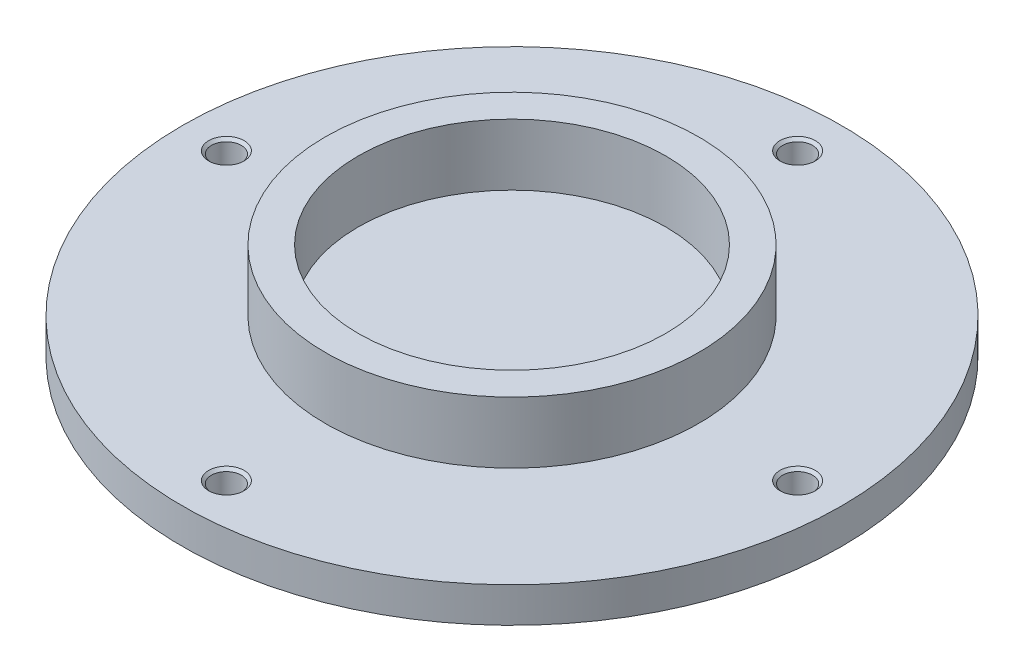
ISO-10303-21;
HEADER;
FILE_DESCRIPTION(('STEP AP214'),'2;1');
FILE_NAME('part.step','',(''),(''),'','','');
FILE_SCHEMA(('AUTOMOTIVE_DESIGN { 1 0 10303 214 1 1 1 1 }'));
ENDSEC;
DATA;
#1=APPLICATION_CONTEXT('core data for automotive mechanical design processes');
#2=APPLICATION_PROTOCOL_DEFINITION('international standard','automotive_design',2000,#1);
#3=PRODUCT_CONTEXT('',#1,'mechanical');
#4=PRODUCT('Part','Part','',(#3));
#5=PRODUCT_RELATED_PRODUCT_CATEGORY('part','',(#4));
#6=PRODUCT_DEFINITION_FORMATION('','',#4);
#7=PRODUCT_DEFINITION_CONTEXT('part definition',#1,'design');
#8=PRODUCT_DEFINITION('design','',#6,#7);
#9=PRODUCT_DEFINITION_SHAPE('','',#8);
#10=(LENGTH_UNIT() NAMED_UNIT(*) SI_UNIT(.MILLI.,.METRE.));
#11=(NAMED_UNIT(*) PLANE_ANGLE_UNIT() SI_UNIT($,.RADIAN.));
#12=(NAMED_UNIT(*) SI_UNIT($,.STERADIAN.) SOLID_ANGLE_UNIT());
#13=UNCERTAINTY_MEASURE_WITH_UNIT(LENGTH_MEASURE(1.E-05),#10,'distance_accuracy_value','');
#14=(GEOMETRIC_REPRESENTATION_CONTEXT(3) GLOBAL_UNCERTAINTY_ASSIGNED_CONTEXT((#13)) GLOBAL_UNIT_ASSIGNED_CONTEXT((#10,
#11,#12)) REPRESENTATION_CONTEXT('',''));
#15=CARTESIAN_POINT('',(0.,0.,0.));
#16=DIRECTION('',(0.,0.,1.));
#17=DIRECTION('',(1.,0.,0.));
#18=AXIS2_PLACEMENT_3D('',#15,#16,#17);
#19=CARTESIAN_POINT('',(0.,0.,0.));
#20=DIRECTION('',(0.,1.,0.));
#21=DIRECTION('',(-1.,0.,0.));
#22=AXIS2_PLACEMENT_3D('',#19,#20,#21);
#23=PLANE('',#22);
#24=CARTESIAN_POINT('',(-65.,-1.26634813746307E-13,0.));
#25=DIRECTION('',(0.,1.,0.));
#26=DIRECTION('',(0.,0.,1.));
#27=AXIS2_PLACEMENT_3D('',#24,#25,#26);
#28=CIRCLE('',#27,3.4);
#29=CARTESIAN_POINT('',(-65.,-1.26634813746307E-13,3.4));
#30=VERTEX_POINT('',#29);
#31=EDGE_CURVE('E95',#30,#30,#28,.T.);
#32=ORIENTED_EDGE('',*,*,#31,.T.);
#33=EDGE_LOOP('',(#32));
#34=FACE_BOUND('',#33,.T.);
#35=CARTESIAN_POINT('',(65.,0.,0.));
#36=DIRECTION('',(0.,1.,0.));
#37=DIRECTION('',(0.,0.,1.));
#38=AXIS2_PLACEMENT_3D('',#35,#36,#37);
#39=CIRCLE('',#38,3.4);
#40=CARTESIAN_POINT('',(65.,0.,3.4));
#41=VERTEX_POINT('',#40);
#42=EDGE_CURVE('E86',#41,#41,#39,.T.);
#43=ORIENTED_EDGE('',*,*,#42,.T.);
#44=EDGE_LOOP('',(#43));
#45=FACE_BOUND('',#44,.T.);
#46=CARTESIAN_POINT('',(0.,0.,65.));
#47=DIRECTION('',(0.,1.,0.));
#48=DIRECTION('',(0.,0.,1.));
#49=AXIS2_PLACEMENT_3D('',#46,#47,#48);
#50=CIRCLE('',#49,3.4);
#51=CARTESIAN_POINT('',(0.,0.,68.4));
#52=VERTEX_POINT('',#51);
#53=EDGE_CURVE('E80',#52,#52,#50,.T.);
#54=ORIENTED_EDGE('',*,*,#53,.T.);
#55=EDGE_LOOP('',(#54));
#56=FACE_BOUND('',#55,.T.);
#57=CARTESIAN_POINT('',(0.,0.,-65.));
#58=DIRECTION('',(0.,1.,0.));
#59=DIRECTION('',(0.,0.,1.));
#60=AXIS2_PLACEMENT_3D('',#57,#58,#59);
#61=CIRCLE('',#60,3.4);
#62=CARTESIAN_POINT('',(0.,0.,-61.6));
#63=VERTEX_POINT('',#62);
#64=EDGE_CURVE('E67',#63,#63,#61,.T.);
#65=ORIENTED_EDGE('',*,*,#64,.T.);
#66=EDGE_LOOP('',(#65));
#67=FACE_BOUND('',#66,.T.);
#68=CARTESIAN_POINT('',(0.,0.,0.));
#69=DIRECTION('',(0.,1.,0.));
#70=DIRECTION('',(-1.,0.,0.));
#71=AXIS2_PLACEMENT_3D('',#68,#69,#70);
#72=CIRCLE('',#71,75.);
#73=CARTESIAN_POINT('',(-75.,0.,0.));
#74=VERTEX_POINT('',#73);
#75=EDGE_CURVE('E10',#74,#74,#72,.T.);
#76=ORIENTED_EDGE('',*,*,#75,.F.);
#77=EDGE_LOOP('',(#76));
#78=FACE_BOUND('',#77,.T.);
#79=ADVANCED_FACE('F43',(#34,#45,#56,#67,#78),#23,.F.);
#80=CARTESIAN_POINT('',(0.,8.,0.));
#81=DIRECTION('',(0.,1.,0.));
#82=DIRECTION('',(-1.,0.,0.));
#83=AXIS2_PLACEMENT_3D('',#80,#81,#82);
#84=CYLINDRICAL_SURFACE('',#83,75.);
#85=CARTESIAN_POINT('',(0.,7.99999999999997,0.));
#86=DIRECTION('',(0.,1.,0.));
#87=DIRECTION('',(-1.,0.,0.));
#88=AXIS2_PLACEMENT_3D('',#85,#86,#87);
#89=CIRCLE('',#88,75.);
#90=CARTESIAN_POINT('',(-75.,7.99999999999993,0.));
#91=VERTEX_POINT('',#90);
#92=EDGE_CURVE('E47',#91,#91,#89,.T.);
#93=ORIENTED_EDGE('',*,*,#92,.F.);
#94=EDGE_LOOP('',(#93));
#95=FACE_BOUND('',#94,.T.);
#96=ORIENTED_EDGE('',*,*,#75,.T.);
#97=EDGE_LOOP('',(#96));
#98=FACE_BOUND('',#97,.T.);
#99=ADVANCED_FACE('F111',(#95,#98),#84,.T.);
#100=CARTESIAN_POINT('',(75.,8.00000000000001,0.));
#101=DIRECTION('',(0.,-1.,0.));
#102=DIRECTION('',(1.,0.,0.));
#103=AXIS2_PLACEMENT_3D('',#100,#101,#102);
#104=PLANE('',#103);
#105=CARTESIAN_POINT('',(-65.,7.99999999999995,0.));
#106=DIRECTION('',(0.,1.,0.));
#107=DIRECTION('',(0.,0.,1.));
#108=AXIS2_PLACEMENT_3D('',#105,#106,#107);
#109=CIRCLE('',#108,4.025);
#110=CARTESIAN_POINT('',(-65.,7.99999999999995,4.025));
#111=VERTEX_POINT('',#110);
#112=EDGE_CURVE('E103',#111,#111,#109,.T.);
#113=ORIENTED_EDGE('',*,*,#112,.F.);
#114=EDGE_LOOP('',(#113));
#115=FACE_BOUND('',#114,.T.);
#116=CARTESIAN_POINT('',(65.,8.,0.));
#117=DIRECTION('',(0.,1.,0.));
#118=DIRECTION('',(0.,0.,1.));
#119=AXIS2_PLACEMENT_3D('',#116,#117,#118);
#120=CIRCLE('',#119,4.025);
#121=CARTESIAN_POINT('',(65.,8.,4.025));
#122=VERTEX_POINT('',#121);
#123=EDGE_CURVE('E92',#122,#122,#120,.T.);
#124=ORIENTED_EDGE('',*,*,#123,.F.);
#125=EDGE_LOOP('',(#124));
#126=FACE_BOUND('',#125,.T.);
#127=CARTESIAN_POINT('',(0.,7.99999999999997,65.));
#128=DIRECTION('',(0.,1.,0.));
#129=DIRECTION('',(0.,0.,1.));
#130=AXIS2_PLACEMENT_3D('',#127,#128,#129);
#131=CIRCLE('',#130,4.025);
#132=CARTESIAN_POINT('',(0.,7.99999999999997,69.025));
#133=VERTEX_POINT('',#132);
#134=EDGE_CURVE('E84',#133,#133,#131,.T.);
#135=ORIENTED_EDGE('',*,*,#134,.F.);
#136=EDGE_LOOP('',(#135));
#137=FACE_BOUND('',#136,.T.);
#138=CARTESIAN_POINT('',(0.,7.99999999999997,-65.));
#139=DIRECTION('',(0.,1.,0.));
#140=DIRECTION('',(0.,0.,1.));
#141=AXIS2_PLACEMENT_3D('',#138,#139,#140);
#142=CIRCLE('',#141,4.025);
#143=CARTESIAN_POINT('',(0.,7.99999999999997,-60.975));
#144=VERTEX_POINT('',#143);
#145=EDGE_CURVE('E73',#144,#144,#142,.T.);
#146=ORIENTED_EDGE('',*,*,#145,.F.);
#147=EDGE_LOOP('',(#146));
#148=FACE_BOUND('',#147,.T.);
#149=CARTESIAN_POINT('',(0.,7.99999999999998,0.));
#150=DIRECTION('',(0.,1.,0.));
#151=DIRECTION('',(-1.,0.,0.));
#152=AXIS2_PLACEMENT_3D('',#149,#150,#151);
#153=CIRCLE('',#152,42.5);
#154=CARTESIAN_POINT('',(-42.5,7.99999999999996,0.));
#155=VERTEX_POINT('',#154);
#156=EDGE_CURVE('E52',#155,#155,#153,.T.);
#157=ORIENTED_EDGE('',*,*,#156,.F.);
#158=EDGE_LOOP('',(#157));
#159=FACE_BOUND('',#158,.T.);
#160=ORIENTED_EDGE('',*,*,#92,.T.);
#161=EDGE_LOOP('',(#160));
#162=FACE_BOUND('',#161,.T.);
#163=ADVANCED_FACE('F110',(#115,#126,#137,#148,#159,#162),#104,.F.);
#164=CARTESIAN_POINT('',(0.,8.,0.));
#165=DIRECTION('',(0.,1.,0.));
#166=DIRECTION('',(-1.,0.,0.));
#167=AXIS2_PLACEMENT_3D('',#164,#165,#166);
#168=CYLINDRICAL_SURFACE('',#167,42.5);
#169=CARTESIAN_POINT('',(0.,22.,0.));
#170=DIRECTION('',(0.,1.,0.));
#171=DIRECTION('',(-1.,0.,0.));
#172=AXIS2_PLACEMENT_3D('',#169,#170,#171);
#173=CIRCLE('',#172,42.5);
#174=CARTESIAN_POINT('',(-42.5,22.,0.));
#175=VERTEX_POINT('',#174);
#176=EDGE_CURVE('E60',#175,#175,#173,.T.);
#177=ORIENTED_EDGE('',*,*,#176,.F.);
#178=EDGE_LOOP('',(#177));
#179=FACE_BOUND('',#178,.T.);
#180=ORIENTED_EDGE('',*,*,#156,.T.);
#181=EDGE_LOOP('',(#180));
#182=FACE_BOUND('',#181,.T.);
#183=ADVANCED_FACE('F109',(#179,#182),#168,.T.);
#184=CARTESIAN_POINT('',(42.5,22.,0.));
#185=DIRECTION('',(0.,-1.,0.));
#186=DIRECTION('',(1.,0.,0.));
#187=AXIS2_PLACEMENT_3D('',#184,#185,#186);
#188=PLANE('',#187);
#189=CARTESIAN_POINT('',(0.,22.,0.));
#190=DIRECTION('',(0.,1.,0.));
#191=DIRECTION('',(-1.,0.,0.));
#192=AXIS2_PLACEMENT_3D('',#189,#190,#191);
#193=CIRCLE('',#192,35.);
#194=CARTESIAN_POINT('',(-35.,22.,0.));
#195=VERTEX_POINT('',#194);
#196=EDGE_CURVE('E65',#195,#195,#193,.T.);
#197=ORIENTED_EDGE('',*,*,#196,.F.);
#198=EDGE_LOOP('',(#197));
#199=FACE_BOUND('',#198,.T.);
#200=ORIENTED_EDGE('',*,*,#176,.T.);
#201=EDGE_LOOP('',(#200));
#202=FACE_BOUND('',#201,.T.);
#203=ADVANCED_FACE('F125',(#199,#202),#188,.F.);
#204=CARTESIAN_POINT('',(0.,8.,0.));
#205=DIRECTION('',(0.,1.,0.));
#206=DIRECTION('',(-1.,0.,0.));
#207=AXIS2_PLACEMENT_3D('',#204,#205,#206);
#208=CYLINDRICAL_SURFACE('',#207,35.);
#209=CARTESIAN_POINT('',(0.,7.99999999999999,0.));
#210=DIRECTION('',(0.,1.,0.));
#211=DIRECTION('',(-1.,0.,0.));
#212=AXIS2_PLACEMENT_3D('',#209,#210,#211);
#213=CIRCLE('',#212,35.);
#214=CARTESIAN_POINT('',(-35.,7.99999999999997,0.));
#215=VERTEX_POINT('',#214);
#216=EDGE_CURVE('E63',#215,#215,#213,.T.);
#217=ORIENTED_EDGE('',*,*,#216,.F.);
#218=EDGE_LOOP('',(#217));
#219=FACE_BOUND('',#218,.T.);
#220=ORIENTED_EDGE('',*,*,#196,.T.);
#221=EDGE_LOOP('',(#220));
#222=FACE_BOUND('',#221,.T.);
#223=ADVANCED_FACE('F126',(#219,#222),#208,.F.);
#224=CARTESIAN_POINT('',(35.,8.00000000000001,0.));
#225=DIRECTION('',(0.,-1.,0.));
#226=DIRECTION('',(1.,0.,0.));
#227=AXIS2_PLACEMENT_3D('',#224,#225,#226);
#228=PLANE('',#227);
#229=ORIENTED_EDGE('',*,*,#216,.T.);
#230=EDGE_LOOP('',(#229));
#231=FACE_BOUND('',#230,.T.);
#232=ADVANCED_FACE('F155',(#231),#228,.F.);
#233=CARTESIAN_POINT('',(0.,7.99999999999997,-65.));
#234=DIRECTION('',(0.,1.,0.));
#235=DIRECTION('',(0.,0.,1.));
#236=AXIS2_PLACEMENT_3D('',#233,#234,#235);
#237=CYLINDRICAL_SURFACE('',#236,3.4);
#238=ORIENTED_EDGE('',*,*,#64,.F.);
#239=EDGE_LOOP('',(#238));
#240=FACE_BOUND('',#239,.T.);
#241=CARTESIAN_POINT('',(0.,7.37499999999997,-65.));
#242=DIRECTION('',(0.,1.,0.));
#243=DIRECTION('',(0.,0.,1.));
#244=AXIS2_PLACEMENT_3D('',#241,#242,#243);
#245=CIRCLE('',#244,3.4);
#246=CARTESIAN_POINT('',(0.,7.37499999999997,-61.6));
#247=VERTEX_POINT('',#246);
#248=EDGE_CURVE('E71',#247,#247,#245,.T.);
#249=ORIENTED_EDGE('',*,*,#248,.T.);
#250=EDGE_LOOP('',(#249));
#251=FACE_BOUND('',#250,.T.);
#252=ADVANCED_FACE('F149',(#240,#251),#237,.F.);
#253=CARTESIAN_POINT('',(0.,7.99999999999997,-65.));
#254=DIRECTION('',(0.,1.,0.));
#255=DIRECTION('',(0.,0.,1.));
#256=AXIS2_PLACEMENT_3D('',#253,#254,#255);
#257=CONICAL_SURFACE('',#256,4.025,0.785398163397447);
#258=ORIENTED_EDGE('',*,*,#248,.F.);
#259=EDGE_LOOP('',(#258));
#260=FACE_BOUND('',#259,.T.);
#261=ORIENTED_EDGE('',*,*,#145,.T.);
#262=EDGE_LOOP('',(#261));
#263=FACE_BOUND('',#262,.T.);
#264=ADVANCED_FACE('F151',(#260,#263),#257,.F.);
#265=CARTESIAN_POINT('',(0.,7.99999999999997,65.));
#266=DIRECTION('',(0.,1.,0.));
#267=DIRECTION('',(0.,0.,1.));
#268=AXIS2_PLACEMENT_3D('',#265,#266,#267);
#269=CYLINDRICAL_SURFACE('',#268,3.4);
#270=ORIENTED_EDGE('',*,*,#53,.F.);
#271=EDGE_LOOP('',(#270));
#272=FACE_BOUND('',#271,.T.);
#273=CARTESIAN_POINT('',(0.,7.37499999999997,65.));
#274=DIRECTION('',(0.,1.,0.));
#275=DIRECTION('',(0.,0.,1.));
#276=AXIS2_PLACEMENT_3D('',#273,#274,#275);
#277=CIRCLE('',#276,3.4);
#278=CARTESIAN_POINT('',(0.,7.37499999999997,68.4));
#279=VERTEX_POINT('',#278);
#280=EDGE_CURVE('E78',#279,#279,#277,.T.);
#281=ORIENTED_EDGE('',*,*,#280,.T.);
#282=EDGE_LOOP('',(#281));
#283=FACE_BOUND('',#282,.T.);
#284=ADVANCED_FACE('F159',(#272,#283),#269,.F.);
#285=CARTESIAN_POINT('',(0.,7.99999999999997,65.));
#286=DIRECTION('',(0.,1.,0.));
#287=DIRECTION('',(0.,0.,1.));
#288=AXIS2_PLACEMENT_3D('',#285,#286,#287);
#289=CONICAL_SURFACE('',#288,4.025,0.785398163397447);
#290=ORIENTED_EDGE('',*,*,#280,.F.);
#291=EDGE_LOOP('',(#290));
#292=FACE_BOUND('',#291,.T.);
#293=ORIENTED_EDGE('',*,*,#134,.T.);
#294=EDGE_LOOP('',(#293));
#295=FACE_BOUND('',#294,.T.);
#296=ADVANCED_FACE('F164',(#292,#295),#289,.F.);
#297=CARTESIAN_POINT('',(65.,8.,0.));
#298=DIRECTION('',(0.,1.,0.));
#299=DIRECTION('',(0.,0.,1.));
#300=AXIS2_PLACEMENT_3D('',#297,#298,#299);
#301=CYLINDRICAL_SURFACE('',#300,3.4);
#302=ORIENTED_EDGE('',*,*,#42,.F.);
#303=EDGE_LOOP('',(#302));
#304=FACE_BOUND('',#303,.T.);
#305=CARTESIAN_POINT('',(65.,7.375,0.));
#306=DIRECTION('',(0.,1.,0.));
#307=DIRECTION('',(0.,0.,1.));
#308=AXIS2_PLACEMENT_3D('',#305,#306,#307);
#309=CIRCLE('',#308,3.4);
#310=CARTESIAN_POINT('',(65.,7.375,3.4));
#311=VERTEX_POINT('',#310);
#312=EDGE_CURVE('E88',#311,#311,#309,.T.);
#313=ORIENTED_EDGE('',*,*,#312,.T.);
#314=EDGE_LOOP('',(#313));
#315=FACE_BOUND('',#314,.T.);
#316=ADVANCED_FACE('F214',(#304,#315),#301,.F.);
#317=CARTESIAN_POINT('',(65.,8.,0.));
#318=DIRECTION('',(0.,1.,0.));
#319=DIRECTION('',(0.,0.,1.));
#320=AXIS2_PLACEMENT_3D('',#317,#318,#319);
#321=CONICAL_SURFACE('',#320,4.025,0.785398163397446);
#322=ORIENTED_EDGE('',*,*,#312,.F.);
#323=EDGE_LOOP('',(#322));
#324=FACE_BOUND('',#323,.T.);
#325=ORIENTED_EDGE('',*,*,#123,.T.);
#326=EDGE_LOOP('',(#325));
#327=FACE_BOUND('',#326,.T.);
#328=ADVANCED_FACE('F224',(#324,#327),#321,.F.);
#329=CARTESIAN_POINT('',(-65.,7.99999999999994,0.));
#330=DIRECTION('',(0.,1.,0.));
#331=DIRECTION('',(0.,0.,1.));
#332=AXIS2_PLACEMENT_3D('',#329,#330,#331);
#333=CYLINDRICAL_SURFACE('',#332,3.4);
#334=ORIENTED_EDGE('',*,*,#31,.F.);
#335=EDGE_LOOP('',(#334));
#336=FACE_BOUND('',#335,.T.);
#337=CARTESIAN_POINT('',(-65.,7.37499999999994,0.));
#338=DIRECTION('',(0.,1.,0.));
#339=DIRECTION('',(0.,0.,1.));
#340=AXIS2_PLACEMENT_3D('',#337,#338,#339);
#341=CIRCLE('',#340,3.4);
#342=CARTESIAN_POINT('',(-65.,7.37499999999994,3.4));
#343=VERTEX_POINT('',#342);
#344=EDGE_CURVE('E96',#343,#343,#341,.T.);
#345=ORIENTED_EDGE('',*,*,#344,.T.);
#346=EDGE_LOOP('',(#345));
#347=FACE_BOUND('',#346,.T.);
#348=ADVANCED_FACE('F231',(#336,#347),#333,.F.);
#349=CARTESIAN_POINT('',(-65.,7.99999999999995,0.));
#350=DIRECTION('',(0.,1.,0.));
#351=DIRECTION('',(0.,0.,1.));
#352=AXIS2_PLACEMENT_3D('',#349,#350,#351);
#353=CONICAL_SURFACE('',#352,4.025,0.785398163397446);
#354=ORIENTED_EDGE('',*,*,#344,.F.);
#355=EDGE_LOOP('',(#354));
#356=FACE_BOUND('',#355,.T.);
#357=ORIENTED_EDGE('',*,*,#112,.T.);
#358=EDGE_LOOP('',(#357));
#359=FACE_BOUND('',#358,.T.);
#360=ADVANCED_FACE('F102',(#356,#359),#353,.F.);
#361=CLOSED_SHELL('',(#79,#99,#163,#183,#203,#223,#232,#252,#264,#284,#296,#316,#328,#348,#360));
#362=MANIFOLD_SOLID_BREP('B2',#361);
#363=ADVANCED_BREP_SHAPE_REPRESENTATION('',(#18,#362),#14);
#364=SHAPE_DEFINITION_REPRESENTATION(#9,#363);
ENDSEC;
END-ISO-10303-21;
